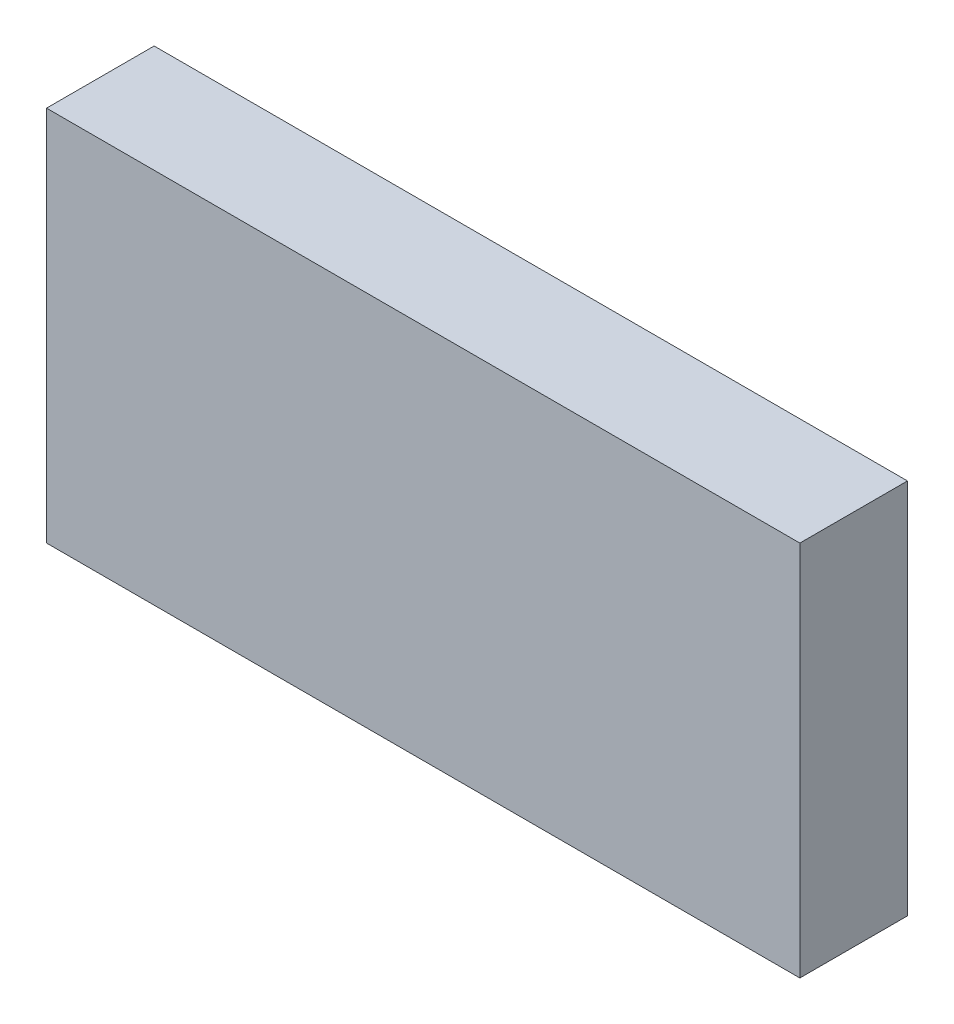
ISO-10303-21;
HEADER;
FILE_DESCRIPTION(('STEP AP214'),'2;1');
FILE_NAME('part.step','',(''),(''),'','','');
FILE_SCHEMA(('AUTOMOTIVE_DESIGN { 1 0 10303 214 1 1 1 1 }'));
ENDSEC;
DATA;
#1=APPLICATION_CONTEXT('core data for automotive mechanical design processes');
#2=APPLICATION_PROTOCOL_DEFINITION('international standard','automotive_design',2000,#1);
#3=PRODUCT_CONTEXT('',#1,'mechanical');
#4=PRODUCT('Part','Part','',(#3));
#5=PRODUCT_RELATED_PRODUCT_CATEGORY('part','',(#4));
#6=PRODUCT_DEFINITION_FORMATION('','',#4);
#7=PRODUCT_DEFINITION_CONTEXT('part definition',#1,'design');
#8=PRODUCT_DEFINITION('design','',#6,#7);
#9=PRODUCT_DEFINITION_SHAPE('','',#8);
#10=(LENGTH_UNIT() NAMED_UNIT(*) SI_UNIT(.MILLI.,.METRE.));
#11=(NAMED_UNIT(*) PLANE_ANGLE_UNIT() SI_UNIT($,.RADIAN.));
#12=(NAMED_UNIT(*) SI_UNIT($,.STERADIAN.) SOLID_ANGLE_UNIT());
#13=UNCERTAINTY_MEASURE_WITH_UNIT(LENGTH_MEASURE(1.E-05),#10,'distance_accuracy_value','');
#14=(GEOMETRIC_REPRESENTATION_CONTEXT(3) GLOBAL_UNCERTAINTY_ASSIGNED_CONTEXT((#13)) GLOBAL_UNIT_ASSIGNED_CONTEXT((#10,
#11,#12)) REPRESENTATION_CONTEXT('',''));
#15=CARTESIAN_POINT('',(0.,0.,0.));
#16=DIRECTION('',(0.,0.,1.));
#17=DIRECTION('',(1.,0.,0.));
#18=AXIS2_PLACEMENT_3D('',#15,#16,#17);
#19=CARTESIAN_POINT('',(3.50000062,1.75000158,1.00000054));
#20=DIRECTION('',(0.,0.,1.));
#21=DIRECTION('',(1.,0.,0.));
#22=AXIS2_PLACEMENT_3D('',#19,#20,#21);
#23=PLANE('',#22);
#24=DIRECTION('',(1.,0.,0.));
#25=VECTOR('',#24,1.);
#26=CARTESIAN_POINT('',(3.50000062,-1.74999904,1.00000054));
#27=LINE('',#26,#25);
#28=CARTESIAN_POINT('',(3.50000062,-1.74999904,1.00000054));
#29=VERTEX_POINT('',#28);
#30=CARTESIAN_POINT('',(-3.50000062,-1.74999904,1.00000054));
#31=VERTEX_POINT('',#30);
#32=EDGE_CURVE('E52',#29,#31,#27,.F.);
#33=ORIENTED_EDGE('',*,*,#32,.F.);
#34=DIRECTION('',(0.,1.,0.));
#35=VECTOR('',#34,1.);
#36=CARTESIAN_POINT('',(3.50000062,1.75000158,1.00000054));
#37=LINE('',#36,#35);
#38=CARTESIAN_POINT('',(3.50000062,1.75000158,1.00000054));
#39=VERTEX_POINT('',#38);
#40=EDGE_CURVE('E67',#39,#29,#37,.F.);
#41=ORIENTED_EDGE('',*,*,#40,.F.);
#42=DIRECTION('',(1.,0.,0.));
#43=VECTOR('',#42,1.);
#44=CARTESIAN_POINT('',(-3.50000062,1.75000158,1.00000054));
#45=LINE('',#44,#43);
#46=CARTESIAN_POINT('',(-3.50000062,1.75000158,1.00000054));
#47=VERTEX_POINT('',#46);
#48=EDGE_CURVE('E19',#47,#39,#45,.T.);
#49=ORIENTED_EDGE('',*,*,#48,.F.);
#50=DIRECTION('',(0.,1.,0.));
#51=VECTOR('',#50,1.);
#52=CARTESIAN_POINT('',(-3.50000062,-1.74999904,1.00000054));
#53=LINE('',#52,#51);
#54=EDGE_CURVE('E57',#31,#47,#53,.T.);
#55=ORIENTED_EDGE('',*,*,#54,.F.);
#56=EDGE_LOOP('',(#33,#41,#49,#55));
#57=FACE_BOUND('',#56,.T.);
#58=ADVANCED_FACE('F16',(#57),#23,.T.);
#59=CARTESIAN_POINT('',(-3.50000062,1.75000158,0.));
#60=DIRECTION('',(0.,1.,0.));
#61=DIRECTION('',(0.,0.,1.));
#62=AXIS2_PLACEMENT_3D('',#59,#60,#61);
#63=PLANE('',#62);
#64=DIRECTION('',(0.,0.,-1.));
#65=VECTOR('',#64,1.);
#66=CARTESIAN_POINT('',(3.50000062,1.75000158,0.));
#67=LINE('',#66,#65);
#68=CARTESIAN_POINT('',(3.50000062,1.75000158,0.));
#69=VERTEX_POINT('',#68);
#70=EDGE_CURVE('E78',#69,#39,#67,.F.);
#71=ORIENTED_EDGE('',*,*,#70,.F.);
#72=DIRECTION('',(1.,0.,0.));
#73=VECTOR('',#72,1.);
#74=CARTESIAN_POINT('',(3.50000062,1.75000158,0.));
#75=LINE('',#74,#73);
#76=CARTESIAN_POINT('',(-3.50000062,1.75000158,0.));
#77=VERTEX_POINT('',#76);
#78=EDGE_CURVE('E73',#69,#77,#75,.F.);
#79=ORIENTED_EDGE('',*,*,#78,.T.);
#80=DIRECTION('',(0.,0.,1.));
#81=VECTOR('',#80,1.);
#82=CARTESIAN_POINT('',(-3.50000062,1.75000158,0.));
#83=LINE('',#82,#81);
#84=EDGE_CURVE('E62',#47,#77,#83,.F.);
#85=ORIENTED_EDGE('',*,*,#84,.F.);
#86=ORIENTED_EDGE('',*,*,#48,.T.);
#87=EDGE_LOOP('',(#71,#79,#85,#86));
#88=FACE_BOUND('',#87,.T.);
#89=ADVANCED_FACE('F72',(#88),#63,.T.);
#90=CARTESIAN_POINT('',(-3.50000062,-1.74999904,0.));
#91=DIRECTION('',(-1.,0.,0.));
#92=DIRECTION('',(0.,0.,1.));
#93=AXIS2_PLACEMENT_3D('',#90,#91,#92);
#94=PLANE('',#93);
#95=ORIENTED_EDGE('',*,*,#84,.T.);
#96=DIRECTION('',(0.,1.,0.));
#97=VECTOR('',#96,1.);
#98=CARTESIAN_POINT('',(-3.50000062,1.75000158,0.));
#99=LINE('',#98,#97);
#100=CARTESIAN_POINT('',(-3.50000062,-1.74999904,0.));
#101=VERTEX_POINT('',#100);
#102=EDGE_CURVE('E83',#77,#101,#99,.F.);
#103=ORIENTED_EDGE('',*,*,#102,.T.);
#104=DIRECTION('',(0.,0.,-1.));
#105=VECTOR('',#104,1.);
#106=CARTESIAN_POINT('',(-3.50000062,-1.74999904,0.));
#107=LINE('',#106,#105);
#108=EDGE_CURVE('E64',#31,#101,#107,.T.);
#109=ORIENTED_EDGE('',*,*,#108,.F.);
#110=ORIENTED_EDGE('',*,*,#54,.T.);
#111=EDGE_LOOP('',(#95,#103,#109,#110));
#112=FACE_BOUND('',#111,.T.);
#113=ADVANCED_FACE('F59',(#112),#94,.T.);
#114=CARTESIAN_POINT('',(3.50000062,-1.74999904,0.));
#115=DIRECTION('',(0.,-1.,0.));
#116=DIRECTION('',(0.,0.,-1.));
#117=AXIS2_PLACEMENT_3D('',#114,#115,#116);
#118=PLANE('',#117);
#119=ORIENTED_EDGE('',*,*,#108,.T.);
#120=DIRECTION('',(1.,0.,0.));
#121=VECTOR('',#120,1.);
#122=CARTESIAN_POINT('',(3.50000062,-1.74999904,0.));
#123=LINE('',#122,#121);
#124=CARTESIAN_POINT('',(3.50000062,-1.74999904,0.));
#125=VERTEX_POINT('',#124);
#126=EDGE_CURVE('E25',#101,#125,#123,.T.);
#127=ORIENTED_EDGE('',*,*,#126,.T.);
#128=DIRECTION('',(0.,0.,-1.));
#129=VECTOR('',#128,1.);
#130=CARTESIAN_POINT('',(3.50000062,-1.74999904,0.));
#131=LINE('',#130,#129);
#132=EDGE_CURVE('E33',#29,#125,#131,.T.);
#133=ORIENTED_EDGE('',*,*,#132,.F.);
#134=ORIENTED_EDGE('',*,*,#32,.T.);
#135=EDGE_LOOP('',(#119,#127,#133,#134));
#136=FACE_BOUND('',#135,.T.);
#137=ADVANCED_FACE('F87',(#136),#118,.T.);
#138=CARTESIAN_POINT('',(3.50000062,1.75000158,0.));
#139=DIRECTION('',(1.,0.,0.));
#140=DIRECTION('',(0.,0.,-1.));
#141=AXIS2_PLACEMENT_3D('',#138,#139,#140);
#142=PLANE('',#141);
#143=ORIENTED_EDGE('',*,*,#132,.T.);
#144=DIRECTION('',(0.,1.,0.));
#145=VECTOR('',#144,1.);
#146=CARTESIAN_POINT('',(3.50000062,1.75000158,0.));
#147=LINE('',#146,#145);
#148=EDGE_CURVE('E11',#125,#69,#147,.T.);
#149=ORIENTED_EDGE('',*,*,#148,.T.);
#150=ORIENTED_EDGE('',*,*,#70,.T.);
#151=ORIENTED_EDGE('',*,*,#40,.T.);
#152=EDGE_LOOP('',(#143,#149,#150,#151));
#153=FACE_BOUND('',#152,.T.);
#154=ADVANCED_FACE('F90',(#153),#142,.T.);
#155=CARTESIAN_POINT('',(3.50000062,1.75000158,0.));
#156=DIRECTION('',(0.,0.,1.));
#157=DIRECTION('',(1.,0.,0.));
#158=AXIS2_PLACEMENT_3D('',#155,#156,#157);
#159=PLANE('',#158);
#160=ORIENTED_EDGE('',*,*,#126,.F.);
#161=ORIENTED_EDGE('',*,*,#102,.F.);
#162=ORIENTED_EDGE('',*,*,#78,.F.);
#163=ORIENTED_EDGE('',*,*,#148,.F.);
#164=EDGE_LOOP('',(#160,#161,#162,#163));
#165=FACE_BOUND('',#164,.T.);
#166=ADVANCED_FACE('F89',(#165),#159,.F.);
#167=CLOSED_SHELL('',(#58,#89,#113,#137,#154,#166));
#168=MANIFOLD_SOLID_BREP('B1',#167);
#169=ADVANCED_BREP_SHAPE_REPRESENTATION('',(#18,#168),#14);
#170=SHAPE_DEFINITION_REPRESENTATION(#9,#169);
ENDSEC;
END-ISO-10303-21;
